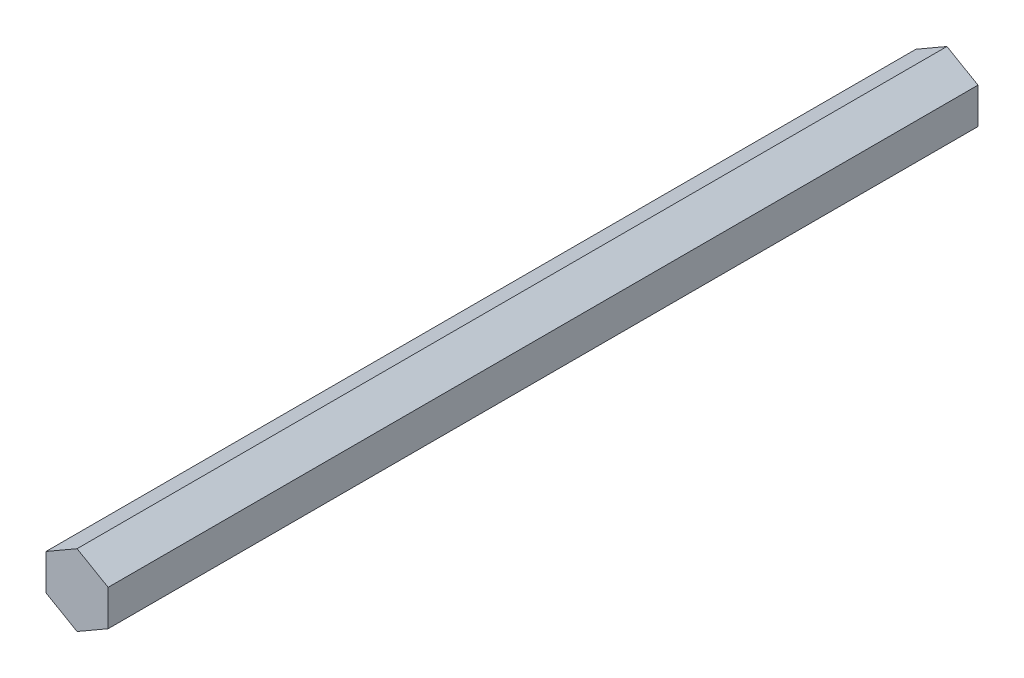
ISO-10303-21;
HEADER;
FILE_DESCRIPTION(('STEP AP214'),'2;1');
FILE_NAME('part.step','',(''),(''),'','','');
FILE_SCHEMA(('AUTOMOTIVE_DESIGN { 1 0 10303 214 1 1 1 1 }'));
ENDSEC;
DATA;
#1=APPLICATION_CONTEXT('core data for automotive mechanical design processes');
#2=APPLICATION_PROTOCOL_DEFINITION('international standard','automotive_design',2000,#1);
#3=PRODUCT_CONTEXT('',#1,'mechanical');
#4=PRODUCT('Part','Part','',(#3));
#5=PRODUCT_RELATED_PRODUCT_CATEGORY('part','',(#4));
#6=PRODUCT_DEFINITION_FORMATION('','',#4);
#7=PRODUCT_DEFINITION_CONTEXT('part definition',#1,'design');
#8=PRODUCT_DEFINITION('design','',#6,#7);
#9=PRODUCT_DEFINITION_SHAPE('','',#8);
#10=(LENGTH_UNIT() NAMED_UNIT(*) SI_UNIT(.MILLI.,.METRE.));
#11=(NAMED_UNIT(*) PLANE_ANGLE_UNIT() SI_UNIT($,.RADIAN.));
#12=(NAMED_UNIT(*) SI_UNIT($,.STERADIAN.) SOLID_ANGLE_UNIT());
#13=UNCERTAINTY_MEASURE_WITH_UNIT(LENGTH_MEASURE(1.E-05),#10,'distance_accuracy_value','');
#14=(GEOMETRIC_REPRESENTATION_CONTEXT(3) GLOBAL_UNCERTAINTY_ASSIGNED_CONTEXT((#13)) GLOBAL_UNIT_ASSIGNED_CONTEXT((#10,
#11,#12)) REPRESENTATION_CONTEXT('',''));
#15=CARTESIAN_POINT('',(0.,0.,0.));
#16=DIRECTION('',(0.,0.,1.));
#17=DIRECTION('',(1.,0.,0.));
#18=AXIS2_PLACEMENT_3D('',#15,#16,#17);
#19=CARTESIAN_POINT('',(6.34999999999995,3.66617420935419,177.8));
#20=DIRECTION('',(-0.499999999999995,-0.866025403784441,0.));
#21=DIRECTION('',(0.866025403784442,-0.499999999999995,0.));
#22=AXIS2_PLACEMENT_3D('',#19,#20,#21);
#23=PLANE('',#22);
#24=DIRECTION('',(-0.866025403784442,0.499999999999995,0.));
#25=VECTOR('',#24,1.);
#26=CARTESIAN_POINT('',(6.34999999999995,3.66617420935419,0.));
#27=LINE('',#26,#25);
#28=CARTESIAN_POINT('',(6.34999999999995,3.66617420935419,0.));
#29=VERTEX_POINT('',#28);
#30=CARTESIAN_POINT('',(0.,7.33234841870824,0.));
#31=VERTEX_POINT('',#30);
#32=EDGE_CURVE('E119',#29,#31,#27,.T.);
#33=ORIENTED_EDGE('',*,*,#32,.T.);
#34=DIRECTION('',(0.,0.,-1.));
#35=VECTOR('',#34,1.);
#36=CARTESIAN_POINT('',(0.,7.33234841870824,177.8));
#37=LINE('',#36,#35);
#38=CARTESIAN_POINT('',(0.,7.33234841870824,177.8));
#39=VERTEX_POINT('',#38);
#40=EDGE_CURVE('E11',#39,#31,#37,.T.);
#41=ORIENTED_EDGE('',*,*,#40,.F.);
#42=DIRECTION('',(-0.866025403784442,0.499999999999995,0.));
#43=VECTOR('',#42,1.);
#44=CARTESIAN_POINT('',(6.34999999999995,3.66617420935419,177.8));
#45=LINE('',#44,#43);
#46=CARTESIAN_POINT('',(6.34999999999995,3.66617420935419,177.8));
#47=VERTEX_POINT('',#46);
#48=EDGE_CURVE('E129',#47,#39,#45,.T.);
#49=ORIENTED_EDGE('',*,*,#48,.F.);
#50=DIRECTION('',(0.,0.,-1.));
#51=VECTOR('',#50,1.);
#52=CARTESIAN_POINT('',(6.34999999999995,3.66617420935419,177.8));
#53=LINE('',#52,#51);
#54=EDGE_CURVE('E115',#47,#29,#53,.T.);
#55=ORIENTED_EDGE('',*,*,#54,.T.);
#56=EDGE_LOOP('',(#33,#41,#49,#55));
#57=FACE_BOUND('',#56,.T.);
#58=ADVANCED_FACE('F35',(#57),#23,.F.);
#59=CARTESIAN_POINT('',(0.,7.33234841870824,177.8));
#60=DIRECTION('',(0.500000000000001,-0.866025403784438,0.));
#61=DIRECTION('',(0.866025403784438,0.500000000000001,0.));
#62=AXIS2_PLACEMENT_3D('',#59,#60,#61);
#63=PLANE('',#62);
#64=DIRECTION('',(-0.866025403784438,-0.500000000000001,0.));
#65=VECTOR('',#64,1.);
#66=CARTESIAN_POINT('',(0.,7.33234841870824,0.));
#67=LINE('',#66,#65);
#68=CARTESIAN_POINT('',(-6.35,3.6661742093541,0.));
#69=VERTEX_POINT('',#68);
#70=EDGE_CURVE('E122',#31,#69,#67,.T.);
#71=ORIENTED_EDGE('',*,*,#70,.T.);
#72=DIRECTION('',(0.,0.,-1.));
#73=VECTOR('',#72,1.);
#74=CARTESIAN_POINT('',(-6.35,3.6661742093541,177.8));
#75=LINE('',#74,#73);
#76=CARTESIAN_POINT('',(-6.35,3.6661742093541,177.8));
#77=VERTEX_POINT('',#76);
#78=EDGE_CURVE('E43',#77,#69,#75,.T.);
#79=ORIENTED_EDGE('',*,*,#78,.F.);
#80=DIRECTION('',(-0.866025403784438,-0.500000000000001,0.));
#81=VECTOR('',#80,1.);
#82=CARTESIAN_POINT('',(0.,7.33234841870824,177.8));
#83=LINE('',#82,#81);
#84=EDGE_CURVE('E88',#39,#77,#83,.T.);
#85=ORIENTED_EDGE('',*,*,#84,.F.);
#86=ORIENTED_EDGE('',*,*,#40,.T.);
#87=EDGE_LOOP('',(#71,#79,#85,#86));
#88=FACE_BOUND('',#87,.T.);
#89=ADVANCED_FACE('F153',(#88),#63,.F.);
#90=CARTESIAN_POINT('',(-6.35,3.6661742093541,177.8));
#91=DIRECTION('',(1.,0.,0.));
#92=DIRECTION('',(0.,1.,0.));
#93=AXIS2_PLACEMENT_3D('',#90,#91,#92);
#94=PLANE('',#93);
#95=DIRECTION('',(0.,-1.,0.));
#96=VECTOR('',#95,1.);
#97=CARTESIAN_POINT('',(-6.35,3.6661742093541,0.));
#98=LINE('',#97,#96);
#99=CARTESIAN_POINT('',(-6.34999999999997,-3.66617420935415,0.));
#100=VERTEX_POINT('',#99);
#101=EDGE_CURVE('E124',#69,#100,#98,.T.);
#102=ORIENTED_EDGE('',*,*,#101,.T.);
#103=DIRECTION('',(0.,0.,-1.));
#104=VECTOR('',#103,1.);
#105=CARTESIAN_POINT('',(-6.34999999999997,-3.66617420935415,177.8));
#106=LINE('',#105,#104);
#107=CARTESIAN_POINT('',(-6.34999999999997,-3.66617420935415,177.8));
#108=VERTEX_POINT('',#107);
#109=EDGE_CURVE('E110',#108,#100,#106,.T.);
#110=ORIENTED_EDGE('',*,*,#109,.F.);
#111=DIRECTION('',(0.,-1.,0.));
#112=VECTOR('',#111,1.);
#113=CARTESIAN_POINT('',(-6.35,3.6661742093541,177.8));
#114=LINE('',#113,#112);
#115=EDGE_CURVE('E101',#77,#108,#114,.T.);
#116=ORIENTED_EDGE('',*,*,#115,.F.);
#117=ORIENTED_EDGE('',*,*,#78,.T.);
#118=EDGE_LOOP('',(#102,#110,#116,#117));
#119=FACE_BOUND('',#118,.T.);
#120=ADVANCED_FACE('F135',(#119),#94,.F.);
#121=CARTESIAN_POINT('',(-6.34999999999997,-3.66617420935415,177.8));
#122=DIRECTION('',(0.499999999999995,0.866025403784441,0.));
#123=DIRECTION('',(-0.866025403784442,0.499999999999995,0.));
#124=AXIS2_PLACEMENT_3D('',#121,#122,#123);
#125=PLANE('',#124);
#126=DIRECTION('',(0.866025403784442,-0.499999999999995,0.));
#127=VECTOR('',#126,1.);
#128=CARTESIAN_POINT('',(-6.34999999999997,-3.66617420935415,0.));
#129=LINE('',#128,#127);
#130=CARTESIAN_POINT('',(0.,-7.33234841870824,0.));
#131=VERTEX_POINT('',#130);
#132=EDGE_CURVE('E109',#100,#131,#129,.T.);
#133=ORIENTED_EDGE('',*,*,#132,.T.);
#134=DIRECTION('',(0.,0.,-1.));
#135=VECTOR('',#134,1.);
#136=CARTESIAN_POINT('',(0.,-7.33234841870824,177.8));
#137=LINE('',#136,#135);
#138=CARTESIAN_POINT('',(0.,-7.33234841870824,177.8));
#139=VERTEX_POINT('',#138);
#140=EDGE_CURVE('E106',#139,#131,#137,.T.);
#141=ORIENTED_EDGE('',*,*,#140,.F.);
#142=DIRECTION('',(0.866025403784442,-0.499999999999995,0.));
#143=VECTOR('',#142,1.);
#144=CARTESIAN_POINT('',(-6.34999999999997,-3.66617420935415,177.8));
#145=LINE('',#144,#143);
#146=EDGE_CURVE('E95',#108,#139,#145,.T.);
#147=ORIENTED_EDGE('',*,*,#146,.F.);
#148=ORIENTED_EDGE('',*,*,#109,.T.);
#149=EDGE_LOOP('',(#133,#141,#147,#148));
#150=FACE_BOUND('',#149,.T.);
#151=ADVANCED_FACE('F107',(#150),#125,.F.);
#152=CARTESIAN_POINT('',(0.,-7.33234841870824,177.8));
#153=DIRECTION('',(-0.500000000000007,0.866025403784434,0.));
#154=DIRECTION('',(-0.866025403784435,-0.500000000000007,0.));
#155=AXIS2_PLACEMENT_3D('',#152,#153,#154);
#156=PLANE('',#155);
#157=DIRECTION('',(0.866025403784435,0.500000000000007,0.));
#158=VECTOR('',#157,1.);
#159=CARTESIAN_POINT('',(0.,-7.33234841870824,0.));
#160=LINE('',#159,#158);
#161=CARTESIAN_POINT('',(6.35000000000002,-3.66617420935406,0.));
#162=VERTEX_POINT('',#161);
#163=EDGE_CURVE('E74',#131,#162,#160,.T.);
#164=ORIENTED_EDGE('',*,*,#163,.T.);
#165=DIRECTION('',(0.,0.,-1.));
#166=VECTOR('',#165,1.);
#167=CARTESIAN_POINT('',(6.35000000000002,-3.66617420935406,177.8));
#168=LINE('',#167,#166);
#169=CARTESIAN_POINT('',(6.35000000000002,-3.66617420935406,177.8));
#170=VERTEX_POINT('',#169);
#171=EDGE_CURVE('E111',#170,#162,#168,.T.);
#172=ORIENTED_EDGE('',*,*,#171,.F.);
#173=DIRECTION('',(0.866025403784435,0.500000000000007,0.));
#174=VECTOR('',#173,1.);
#175=CARTESIAN_POINT('',(0.,-7.33234841870824,177.8));
#176=LINE('',#175,#174);
#177=EDGE_CURVE('E99',#139,#170,#176,.T.);
#178=ORIENTED_EDGE('',*,*,#177,.F.);
#179=ORIENTED_EDGE('',*,*,#140,.T.);
#180=EDGE_LOOP('',(#164,#172,#178,#179));
#181=FACE_BOUND('',#180,.T.);
#182=ADVANCED_FACE('F113',(#181),#156,.F.);
#183=CARTESIAN_POINT('',(6.35000000000002,-3.66617420935406,177.8));
#184=DIRECTION('',(-1.,0.,0.));
#185=DIRECTION('',(0.,-1.,0.));
#186=AXIS2_PLACEMENT_3D('',#183,#184,#185);
#187=PLANE('',#186);
#188=DIRECTION('',(0.,1.,0.));
#189=VECTOR('',#188,1.);
#190=CARTESIAN_POINT('',(6.35000000000002,-3.66617420935406,0.));
#191=LINE('',#190,#189);
#192=EDGE_CURVE('E80',#162,#29,#191,.T.);
#193=ORIENTED_EDGE('',*,*,#192,.T.);
#194=ORIENTED_EDGE('',*,*,#54,.F.);
#195=DIRECTION('',(0.,1.,0.));
#196=VECTOR('',#195,1.);
#197=CARTESIAN_POINT('',(6.35000000000002,-3.66617420935406,177.8));
#198=LINE('',#197,#196);
#199=EDGE_CURVE('E51',#170,#47,#198,.T.);
#200=ORIENTED_EDGE('',*,*,#199,.F.);
#201=ORIENTED_EDGE('',*,*,#171,.T.);
#202=EDGE_LOOP('',(#193,#194,#200,#201));
#203=FACE_BOUND('',#202,.T.);
#204=ADVANCED_FACE('F142',(#203),#187,.F.);
#205=CARTESIAN_POINT('',(0.,0.,177.8));
#206=DIRECTION('',(0.,0.,1.));
#207=DIRECTION('',(1.,0.,0.));
#208=AXIS2_PLACEMENT_3D('',#205,#206,#207);
#209=PLANE('',#208);
#210=ORIENTED_EDGE('',*,*,#48,.T.);
#211=ORIENTED_EDGE('',*,*,#84,.T.);
#212=ORIENTED_EDGE('',*,*,#115,.T.);
#213=ORIENTED_EDGE('',*,*,#146,.T.);
#214=ORIENTED_EDGE('',*,*,#177,.T.);
#215=ORIENTED_EDGE('',*,*,#199,.T.);
#216=EDGE_LOOP('',(#210,#211,#212,#213,#214,#215));
#217=FACE_BOUND('',#216,.T.);
#218=ADVANCED_FACE('F97',(#217),#209,.T.);
#219=CARTESIAN_POINT('',(0.,0.,0.));
#220=DIRECTION('',(0.,0.,1.));
#221=DIRECTION('',(1.,0.,0.));
#222=AXIS2_PLACEMENT_3D('',#219,#220,#221);
#223=PLANE('',#222);
#224=ORIENTED_EDGE('',*,*,#32,.F.);
#225=ORIENTED_EDGE('',*,*,#192,.F.);
#226=ORIENTED_EDGE('',*,*,#163,.F.);
#227=ORIENTED_EDGE('',*,*,#132,.F.);
#228=ORIENTED_EDGE('',*,*,#101,.F.);
#229=ORIENTED_EDGE('',*,*,#70,.F.);
#230=EDGE_LOOP('',(#224,#225,#226,#227,#228,#229));
#231=FACE_BOUND('',#230,.T.);
#232=ADVANCED_FACE('F138',(#231),#223,.F.);
#233=CLOSED_SHELL('',(#58,#89,#120,#151,#182,#204,#218,#232));
#234=MANIFOLD_SOLID_BREP('B2',#233);
#235=ADVANCED_BREP_SHAPE_REPRESENTATION('',(#18,#234),#14);
#236=SHAPE_DEFINITION_REPRESENTATION(#9,#235);
ENDSEC;
END-ISO-10303-21;
